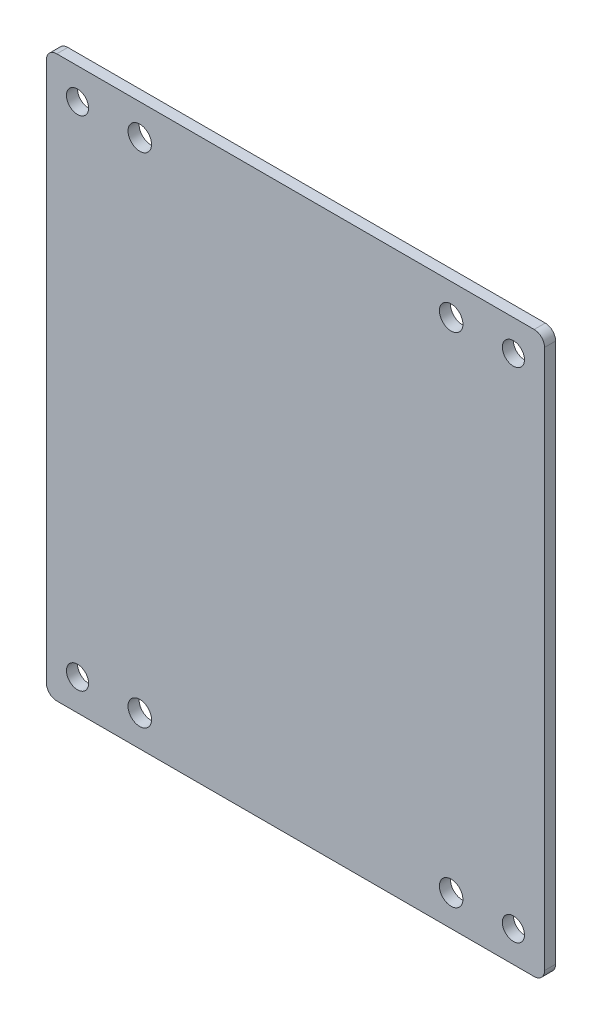
ISO-10303-21;
HEADER;
FILE_DESCRIPTION(('STEP AP214'),'2;1');
FILE_NAME('part.step','',(''),(''),'','','');
FILE_SCHEMA(('AUTOMOTIVE_DESIGN { 1 0 10303 214 1 1 1 1 }'));
ENDSEC;
DATA;
#1=APPLICATION_CONTEXT('core data for automotive mechanical design processes');
#2=APPLICATION_PROTOCOL_DEFINITION('international standard','automotive_design',2000,#1);
#3=PRODUCT_CONTEXT('',#1,'mechanical');
#4=PRODUCT('Part','Part','',(#3));
#5=PRODUCT_RELATED_PRODUCT_CATEGORY('part','',(#4));
#6=PRODUCT_DEFINITION_FORMATION('','',#4);
#7=PRODUCT_DEFINITION_CONTEXT('part definition',#1,'design');
#8=PRODUCT_DEFINITION('design','',#6,#7);
#9=PRODUCT_DEFINITION_SHAPE('','',#8);
#10=(LENGTH_UNIT() NAMED_UNIT(*) SI_UNIT(.MILLI.,.METRE.));
#11=(NAMED_UNIT(*) PLANE_ANGLE_UNIT() SI_UNIT($,.RADIAN.));
#12=(NAMED_UNIT(*) SI_UNIT($,.STERADIAN.) SOLID_ANGLE_UNIT());
#13=UNCERTAINTY_MEASURE_WITH_UNIT(LENGTH_MEASURE(1.E-05),#10,'distance_accuracy_value','');
#14=(GEOMETRIC_REPRESENTATION_CONTEXT(3) GLOBAL_UNCERTAINTY_ASSIGNED_CONTEXT((#13)) GLOBAL_UNIT_ASSIGNED_CONTEXT((#10,
#11,#12)) REPRESENTATION_CONTEXT('',''));
#15=CARTESIAN_POINT('',(0.,0.,0.));
#16=DIRECTION('',(0.,0.,1.));
#17=DIRECTION('',(1.,0.,0.));
#18=AXIS2_PLACEMENT_3D('',#15,#16,#17);
#19=CARTESIAN_POINT('',(79.0698038032,0.,1.6));
#20=DIRECTION('',(-1.,0.,0.));
#21=DIRECTION('',(0.,0.,1.));
#22=AXIS2_PLACEMENT_3D('',#19,#20,#21);
#23=PLANE('',#22);
#24=DIRECTION('',(0.,1.,0.));
#25=VECTOR('',#24,1.);
#26=CARTESIAN_POINT('',(79.0698038032,0.,0.));
#27=LINE('',#26,#25);
#28=CARTESIAN_POINT('',(79.0698038032,220.6038206321,0.));
#29=VERTEX_POINT('',#28);
#30=CARTESIAN_POINT('',(79.0698038032,298.6084304899,0.));
#31=VERTEX_POINT('',#30);
#32=EDGE_CURVE('E155',#29,#31,#27,.T.);
#33=ORIENTED_EDGE('',*,*,#32,.T.);
#34=DIRECTION('',(0.,0.,-1.));
#35=VECTOR('',#34,1.);
#36=CARTESIAN_POINT('',(79.0698038032,298.6084304899,1.6));
#37=LINE('',#36,#35);
#38=CARTESIAN_POINT('',(79.0698038032,298.6084304899,1.6));
#39=VERTEX_POINT('',#38);
#40=EDGE_CURVE('E11',#39,#31,#37,.T.);
#41=ORIENTED_EDGE('',*,*,#40,.F.);
#42=DIRECTION('',(0.,1.,0.));
#43=VECTOR('',#42,1.);
#44=CARTESIAN_POINT('',(79.0698038032,0.,1.6));
#45=LINE('',#44,#43);
#46=CARTESIAN_POINT('',(79.0698038032,220.6038206321,1.6));
#47=VERTEX_POINT('',#46);
#48=EDGE_CURVE('E201',#47,#39,#45,.T.);
#49=ORIENTED_EDGE('',*,*,#48,.F.);
#50=DIRECTION('',(0.,0.,-1.));
#51=VECTOR('',#50,1.);
#52=CARTESIAN_POINT('',(79.0698038032,220.6038206321,1.6));
#53=LINE('',#52,#51);
#54=EDGE_CURVE('E127',#47,#29,#53,.T.);
#55=ORIENTED_EDGE('',*,*,#54,.T.);
#56=EDGE_LOOP('',(#33,#41,#49,#55));
#57=FACE_BOUND('',#56,.T.);
#58=ADVANCED_FACE('F34',(#57),#23,.F.);
#59=CARTESIAN_POINT('',(77.5698038032,298.6084304899,1.6));
#60=DIRECTION('',(0.,0.,-1.));
#61=DIRECTION('',(-1.,0.,0.));
#62=AXIS2_PLACEMENT_3D('',#59,#60,#61);
#63=CYLINDRICAL_SURFACE('',#62,1.5);
#64=CARTESIAN_POINT('',(77.5698038032,298.6084304899,0.));
#65=DIRECTION('',(0.,0.,1.));
#66=DIRECTION('',(1.,0.,0.));
#67=AXIS2_PLACEMENT_3D('',#64,#65,#66);
#68=CIRCLE('',#67,1.5);
#69=CARTESIAN_POINT('',(77.5698038032,300.1084304899,0.));
#70=VERTEX_POINT('',#69);
#71=EDGE_CURVE('E158',#31,#70,#68,.T.);
#72=ORIENTED_EDGE('',*,*,#71,.T.);
#73=DIRECTION('',(0.,0.,-1.));
#74=VECTOR('',#73,1.);
#75=CARTESIAN_POINT('',(77.5698038032,300.1084304899,1.6));
#76=LINE('',#75,#74);
#77=CARTESIAN_POINT('',(77.5698038032,300.1084304899,1.6));
#78=VERTEX_POINT('',#77);
#79=EDGE_CURVE('E43',#78,#70,#76,.T.);
#80=ORIENTED_EDGE('',*,*,#79,.F.);
#81=CARTESIAN_POINT('',(77.5698038032,298.6084304899,1.6));
#82=DIRECTION('',(0.,0.,1.));
#83=DIRECTION('',(1.,0.,0.));
#84=AXIS2_PLACEMENT_3D('',#81,#82,#83);
#85=CIRCLE('',#84,1.5);
#86=EDGE_CURVE('E94',#39,#78,#85,.T.);
#87=ORIENTED_EDGE('',*,*,#86,.F.);
#88=ORIENTED_EDGE('',*,*,#40,.T.);
#89=EDGE_LOOP('',(#72,#80,#87,#88));
#90=FACE_BOUND('',#89,.T.);
#91=ADVANCED_FACE('F263',(#90),#63,.T.);
#92=CARTESIAN_POINT('',(0.,300.1084304899,1.6));
#93=DIRECTION('',(0.,-1.,0.));
#94=DIRECTION('',(0.,0.,-1.));
#95=AXIS2_PLACEMENT_3D('',#92,#93,#94);
#96=PLANE('',#95);
#97=DIRECTION('',(-1.,0.,0.));
#98=VECTOR('',#97,1.);
#99=CARTESIAN_POINT('',(0.,300.1084304899,0.));
#100=LINE('',#99,#98);
#101=CARTESIAN_POINT('',(8.567399569,300.1084304899,0.));
#102=VERTEX_POINT('',#101);
#103=EDGE_CURVE('E160',#70,#102,#100,.T.);
#104=ORIENTED_EDGE('',*,*,#103,.T.);
#105=DIRECTION('',(0.,0.,-1.));
#106=VECTOR('',#105,1.);
#107=CARTESIAN_POINT('',(8.567399569,300.1084304899,1.6));
#108=LINE('',#107,#106);
#109=CARTESIAN_POINT('',(8.567399569,300.1084304899,1.6));
#110=VERTEX_POINT('',#109);
#111=EDGE_CURVE('E176',#110,#102,#108,.T.);
#112=ORIENTED_EDGE('',*,*,#111,.F.);
#113=DIRECTION('',(-1.,0.,0.));
#114=VECTOR('',#113,1.);
#115=CARTESIAN_POINT('',(0.,300.1084304899,1.6));
#116=LINE('',#115,#114);
#117=EDGE_CURVE('E184',#78,#110,#116,.T.);
#118=ORIENTED_EDGE('',*,*,#117,.F.);
#119=ORIENTED_EDGE('',*,*,#79,.T.);
#120=EDGE_LOOP('',(#104,#112,#118,#119));
#121=FACE_BOUND('',#120,.T.);
#122=ADVANCED_FACE('F182',(#121),#96,.F.);
#123=CARTESIAN_POINT('',(8.567399569,298.6084304899,1.6));
#124=DIRECTION('',(0.,0.,-1.));
#125=DIRECTION('',(-1.,0.,0.));
#126=AXIS2_PLACEMENT_3D('',#123,#124,#125);
#127=CYLINDRICAL_SURFACE('',#126,1.50000000000003);
#128=CARTESIAN_POINT('',(8.567399569,298.6084304899,0.));
#129=DIRECTION('',(0.,0.,1.));
#130=DIRECTION('',(1.,0.,0.));
#131=AXIS2_PLACEMENT_3D('',#128,#129,#130);
#132=CIRCLE('',#131,1.50000000000003);
#133=CARTESIAN_POINT('',(7.067399569,298.6084304899,0.));
#134=VERTEX_POINT('',#133);
#135=EDGE_CURVE('E162',#102,#134,#132,.T.);
#136=ORIENTED_EDGE('',*,*,#135,.T.);
#137=DIRECTION('',(0.,0.,-1.));
#138=VECTOR('',#137,1.);
#139=CARTESIAN_POINT('',(7.067399569,298.6084304899,1.6));
#140=LINE('',#139,#138);
#141=CARTESIAN_POINT('',(7.067399569,298.6084304899,1.6));
#142=VERTEX_POINT('',#141);
#143=EDGE_CURVE('E173',#142,#134,#140,.T.);
#144=ORIENTED_EDGE('',*,*,#143,.F.);
#145=CARTESIAN_POINT('',(8.567399569,298.6084304899,1.6));
#146=DIRECTION('',(0.,0.,1.));
#147=DIRECTION('',(1.,0.,0.));
#148=AXIS2_PLACEMENT_3D('',#145,#146,#147);
#149=CIRCLE('',#148,1.50000000000003);
#150=EDGE_CURVE('E196',#110,#142,#149,.T.);
#151=ORIENTED_EDGE('',*,*,#150,.F.);
#152=ORIENTED_EDGE('',*,*,#111,.T.);
#153=EDGE_LOOP('',(#136,#144,#151,#152));
#154=FACE_BOUND('',#153,.T.);
#155=ADVANCED_FACE('F192',(#154),#127,.T.);
#156=CARTESIAN_POINT('',(7.067399569,0.,1.6));
#157=DIRECTION('',(1.,0.,0.));
#158=DIRECTION('',(0.,0.,-1.));
#159=AXIS2_PLACEMENT_3D('',#156,#157,#158);
#160=PLANE('',#159);
#161=DIRECTION('',(0.,-1.,0.));
#162=VECTOR('',#161,1.);
#163=CARTESIAN_POINT('',(7.067399569,0.,0.));
#164=LINE('',#163,#162);
#165=CARTESIAN_POINT('',(7.067399569,220.6038206321,0.));
#166=VERTEX_POINT('',#165);
#167=EDGE_CURVE('E164',#134,#166,#164,.T.);
#168=ORIENTED_EDGE('',*,*,#167,.T.);
#169=DIRECTION('',(0.,0.,-1.));
#170=VECTOR('',#169,1.);
#171=CARTESIAN_POINT('',(7.067399569,220.6038206321,1.6));
#172=LINE('',#171,#170);
#173=CARTESIAN_POINT('',(7.067399569,220.6038206321,1.6));
#174=VERTEX_POINT('',#173);
#175=EDGE_CURVE('E122',#174,#166,#172,.T.);
#176=ORIENTED_EDGE('',*,*,#175,.F.);
#177=DIRECTION('',(0.,-1.,0.));
#178=VECTOR('',#177,1.);
#179=CARTESIAN_POINT('',(7.067399569,0.,1.6));
#180=LINE('',#179,#178);
#181=EDGE_CURVE('E113',#142,#174,#180,.T.);
#182=ORIENTED_EDGE('',*,*,#181,.F.);
#183=ORIENTED_EDGE('',*,*,#143,.T.);
#184=EDGE_LOOP('',(#168,#176,#182,#183));
#185=FACE_BOUND('',#184,.T.);
#186=ADVANCED_FACE('F195',(#185),#160,.F.);
#187=CARTESIAN_POINT('',(8.567399569,220.6038206321,1.6));
#188=DIRECTION('',(0.,0.,-1.));
#189=DIRECTION('',(-1.,0.,0.));
#190=AXIS2_PLACEMENT_3D('',#187,#188,#189);
#191=CYLINDRICAL_SURFACE('',#190,1.5);
#192=CARTESIAN_POINT('',(8.567399569,220.6038206321,0.));
#193=DIRECTION('',(0.,0.,1.));
#194=DIRECTION('',(1.,0.,0.));
#195=AXIS2_PLACEMENT_3D('',#192,#193,#194);
#196=CIRCLE('',#195,1.5);
#197=CARTESIAN_POINT('',(8.567399569,219.1038206321,0.));
#198=VERTEX_POINT('',#197);
#199=EDGE_CURVE('E121',#166,#198,#196,.T.);
#200=ORIENTED_EDGE('',*,*,#199,.T.);
#201=DIRECTION('',(0.,0.,-1.));
#202=VECTOR('',#201,1.);
#203=CARTESIAN_POINT('',(8.567399569,219.1038206321,1.6));
#204=LINE('',#203,#202);
#205=CARTESIAN_POINT('',(8.567399569,219.1038206321,1.6));
#206=VERTEX_POINT('',#205);
#207=EDGE_CURVE('E118',#206,#198,#204,.T.);
#208=ORIENTED_EDGE('',*,*,#207,.F.);
#209=CARTESIAN_POINT('',(8.567399569,220.6038206321,1.6));
#210=DIRECTION('',(0.,0.,1.));
#211=DIRECTION('',(1.,0.,0.));
#212=AXIS2_PLACEMENT_3D('',#209,#210,#211);
#213=CIRCLE('',#212,1.5);
#214=EDGE_CURVE('E107',#174,#206,#213,.T.);
#215=ORIENTED_EDGE('',*,*,#214,.F.);
#216=ORIENTED_EDGE('',*,*,#175,.T.);
#217=EDGE_LOOP('',(#200,#208,#215,#216));
#218=FACE_BOUND('',#217,.T.);
#219=ADVANCED_FACE('F119',(#218),#191,.T.);
#220=CARTESIAN_POINT('',(0.,219.1038206321,1.6));
#221=DIRECTION('',(0.,1.,0.));
#222=DIRECTION('',(0.,0.,1.));
#223=AXIS2_PLACEMENT_3D('',#220,#221,#222);
#224=PLANE('',#223);
#225=DIRECTION('',(1.,0.,0.));
#226=VECTOR('',#225,1.);
#227=CARTESIAN_POINT('',(0.,219.1038206321,0.));
#228=LINE('',#227,#226);
#229=CARTESIAN_POINT('',(77.5698038032,219.1038206321,0.));
#230=VERTEX_POINT('',#229);
#231=EDGE_CURVE('E80',#198,#230,#228,.T.);
#232=ORIENTED_EDGE('',*,*,#231,.T.);
#233=DIRECTION('',(0.,0.,-1.));
#234=VECTOR('',#233,1.);
#235=CARTESIAN_POINT('',(77.5698038032,219.1038206321,1.6));
#236=LINE('',#235,#234);
#237=CARTESIAN_POINT('',(77.5698038032,219.1038206321,1.6));
#238=VERTEX_POINT('',#237);
#239=EDGE_CURVE('E123',#238,#230,#236,.T.);
#240=ORIENTED_EDGE('',*,*,#239,.F.);
#241=DIRECTION('',(1.,0.,0.));
#242=VECTOR('',#241,1.);
#243=CARTESIAN_POINT('',(0.,219.1038206321,1.6));
#244=LINE('',#243,#242);
#245=EDGE_CURVE('E111',#206,#238,#244,.T.);
#246=ORIENTED_EDGE('',*,*,#245,.F.);
#247=ORIENTED_EDGE('',*,*,#207,.T.);
#248=EDGE_LOOP('',(#232,#240,#246,#247));
#249=FACE_BOUND('',#248,.T.);
#250=ADVANCED_FACE('F125',(#249),#224,.F.);
#251=CARTESIAN_POINT('',(20.5667305647,223.60348613,1.6));
#252=DIRECTION('',(0.,0.,-1.));
#253=DIRECTION('',(-1.,0.,0.));
#254=AXIS2_PLACEMENT_3D('',#251,#252,#253);
#255=CYLINDRICAL_SURFACE('',#254,1.7);
#256=CARTESIAN_POINT('',(20.5667305647,223.60348613,1.6));
#257=DIRECTION('',(0.,0.,1.));
#258=DIRECTION('',(1.,0.,0.));
#259=AXIS2_PLACEMENT_3D('',#256,#257,#258);
#260=CIRCLE('',#259,1.7);
#261=CARTESIAN_POINT('',(22.2667305647,223.60348613,1.6));
#262=VERTEX_POINT('',#261);
#263=EDGE_CURVE('E203',#262,#262,#260,.T.);
#264=ORIENTED_EDGE('',*,*,#263,.T.);
#265=EDGE_LOOP('',(#264));
#266=FACE_BOUND('',#265,.T.);
#267=CARTESIAN_POINT('',(20.5667305647,223.60348613,0.));
#268=DIRECTION('',(0.,0.,1.));
#269=DIRECTION('',(1.,0.,0.));
#270=AXIS2_PLACEMENT_3D('',#267,#268,#269);
#271=CIRCLE('',#270,1.7);
#272=CARTESIAN_POINT('',(22.2667305647,223.60348613,0.));
#273=VERTEX_POINT('',#272);
#274=EDGE_CURVE('E152',#273,#273,#271,.T.);
#275=ORIENTED_EDGE('',*,*,#274,.F.);
#276=EDGE_LOOP('',(#275));
#277=FACE_BOUND('',#276,.T.);
#278=ADVANCED_FACE('F247',(#266,#277),#255,.F.);
#279=CARTESIAN_POINT('',(65.5701383054,223.60348613,1.6));
#280=DIRECTION('',(0.,0.,-1.));
#281=DIRECTION('',(-1.,0.,0.));
#282=AXIS2_PLACEMENT_3D('',#279,#280,#281);
#283=CYLINDRICAL_SURFACE('',#282,1.69999999999999);
#284=CARTESIAN_POINT('',(65.5701383054,223.60348613,1.6));
#285=DIRECTION('',(0.,0.,1.));
#286=DIRECTION('',(1.,0.,0.));
#287=AXIS2_PLACEMENT_3D('',#284,#285,#286);
#288=CIRCLE('',#287,1.69999999999999);
#289=CARTESIAN_POINT('',(67.2701383054,223.60348613,1.6));
#290=VERTEX_POINT('',#289);
#291=EDGE_CURVE('E206',#290,#290,#288,.T.);
#292=ORIENTED_EDGE('',*,*,#291,.T.);
#293=EDGE_LOOP('',(#292));
#294=FACE_BOUND('',#293,.T.);
#295=CARTESIAN_POINT('',(65.5701383054,223.60348613,0.));
#296=DIRECTION('',(0.,0.,1.));
#297=DIRECTION('',(1.,0.,0.));
#298=AXIS2_PLACEMENT_3D('',#295,#296,#297);
#299=CIRCLE('',#298,1.69999999999999);
#300=CARTESIAN_POINT('',(67.2701383054,223.60348613,0.));
#301=VERTEX_POINT('',#300);
#302=EDGE_CURVE('E149',#301,#301,#299,.T.);
#303=ORIENTED_EDGE('',*,*,#302,.F.);
#304=EDGE_LOOP('',(#303));
#305=FACE_BOUND('',#304,.T.);
#306=ADVANCED_FACE('F250',(#294,#305),#283,.F.);
#307=CARTESIAN_POINT('',(11.5670650668,223.60348613,1.6));
#308=DIRECTION('',(0.,0.,-1.));
#309=DIRECTION('',(-1.,0.,0.));
#310=AXIS2_PLACEMENT_3D('',#307,#308,#309);
#311=CYLINDRICAL_SURFACE('',#310,1.60027921638226);
#312=CARTESIAN_POINT('',(11.5670650668,223.60348613,1.6));
#313=DIRECTION('',(0.,0.,1.));
#314=DIRECTION('',(1.,0.,0.));
#315=AXIS2_PLACEMENT_3D('',#312,#313,#314);
#316=CIRCLE('',#315,1.60027921638226);
#317=CARTESIAN_POINT('',(13.1673442831823,223.60348613,1.6));
#318=VERTEX_POINT('',#317);
#319=EDGE_CURVE('E209',#318,#318,#316,.T.);
#320=ORIENTED_EDGE('',*,*,#319,.T.);
#321=EDGE_LOOP('',(#320));
#322=FACE_BOUND('',#321,.T.);
#323=CARTESIAN_POINT('',(11.5670650668,223.60348613,0.));
#324=DIRECTION('',(0.,0.,1.));
#325=DIRECTION('',(1.,0.,0.));
#326=AXIS2_PLACEMENT_3D('',#323,#324,#325);
#327=CIRCLE('',#326,1.60027921638226);
#328=CARTESIAN_POINT('',(13.1673442831823,223.60348613,0.));
#329=VERTEX_POINT('',#328);
#330=EDGE_CURVE('E146',#329,#329,#327,.T.);
#331=ORIENTED_EDGE('',*,*,#330,.F.);
#332=EDGE_LOOP('',(#331));
#333=FACE_BOUND('',#332,.T.);
#334=ADVANCED_FACE('F275',(#322,#333),#311,.F.);
#335=CARTESIAN_POINT('',(74.5698038032,223.60348613,1.6));
#336=DIRECTION('',(0.,0.,-1.));
#337=DIRECTION('',(-1.,0.,0.));
#338=AXIS2_PLACEMENT_3D('',#335,#336,#337);
#339=CYLINDRICAL_SURFACE('',#338,1.60027921638224);
#340=CARTESIAN_POINT('',(74.5698038032,223.60348613,1.6));
#341=DIRECTION('',(0.,0.,1.));
#342=DIRECTION('',(1.,0.,0.));
#343=AXIS2_PLACEMENT_3D('',#340,#341,#342);
#344=CIRCLE('',#343,1.60027921638224);
#345=CARTESIAN_POINT('',(76.1700830195823,223.60348613,1.6));
#346=VERTEX_POINT('',#345);
#347=EDGE_CURVE('E212',#346,#346,#344,.T.);
#348=ORIENTED_EDGE('',*,*,#347,.T.);
#349=EDGE_LOOP('',(#348));
#350=FACE_BOUND('',#349,.T.);
#351=CARTESIAN_POINT('',(74.5698038032,223.60348613,0.));
#352=DIRECTION('',(0.,0.,1.));
#353=DIRECTION('',(1.,0.,0.));
#354=AXIS2_PLACEMENT_3D('',#351,#352,#353);
#355=CIRCLE('',#354,1.60027921638224);
#356=CARTESIAN_POINT('',(76.1700830195823,223.60348613,0.));
#357=VERTEX_POINT('',#356);
#358=EDGE_CURVE('E143',#357,#357,#355,.T.);
#359=ORIENTED_EDGE('',*,*,#358,.F.);
#360=EDGE_LOOP('',(#359));
#361=FACE_BOUND('',#360,.T.);
#362=ADVANCED_FACE('F279',(#350,#361),#339,.F.);
#363=CARTESIAN_POINT('',(20.5667305647,295.6084304899,1.6));
#364=DIRECTION('',(0.,0.,-1.));
#365=DIRECTION('',(-1.,0.,0.));
#366=AXIS2_PLACEMENT_3D('',#363,#364,#365);
#367=CYLINDRICAL_SURFACE('',#366,1.7);
#368=CARTESIAN_POINT('',(20.5667305647,295.6084304899,1.6));
#369=DIRECTION('',(0.,0.,1.));
#370=DIRECTION('',(1.,0.,0.));
#371=AXIS2_PLACEMENT_3D('',#368,#369,#370);
#372=CIRCLE('',#371,1.7);
#373=CARTESIAN_POINT('',(22.2667305647,295.6084304899,1.6));
#374=VERTEX_POINT('',#373);
#375=EDGE_CURVE('E215',#374,#374,#372,.T.);
#376=ORIENTED_EDGE('',*,*,#375,.T.);
#377=EDGE_LOOP('',(#376));
#378=FACE_BOUND('',#377,.T.);
#379=CARTESIAN_POINT('',(20.5667305647,295.6084304899,0.));
#380=DIRECTION('',(0.,0.,1.));
#381=DIRECTION('',(1.,0.,0.));
#382=AXIS2_PLACEMENT_3D('',#379,#380,#381);
#383=CIRCLE('',#382,1.7);
#384=CARTESIAN_POINT('',(22.2667305647,295.6084304899,0.));
#385=VERTEX_POINT('',#384);
#386=EDGE_CURVE('E140',#385,#385,#383,.T.);
#387=ORIENTED_EDGE('',*,*,#386,.F.);
#388=EDGE_LOOP('',(#387));
#389=FACE_BOUND('',#388,.T.);
#390=ADVANCED_FACE('F283',(#378,#389),#367,.F.);
#391=CARTESIAN_POINT('',(65.5701383054,295.6084304899,1.6));
#392=DIRECTION('',(0.,0.,-1.));
#393=DIRECTION('',(-1.,0.,0.));
#394=AXIS2_PLACEMENT_3D('',#391,#392,#393);
#395=CYLINDRICAL_SURFACE('',#394,1.69999999999999);
#396=CARTESIAN_POINT('',(65.5701383054,295.6084304899,1.6));
#397=DIRECTION('',(0.,0.,1.));
#398=DIRECTION('',(1.,0.,0.));
#399=AXIS2_PLACEMENT_3D('',#396,#397,#398);
#400=CIRCLE('',#399,1.69999999999999);
#401=CARTESIAN_POINT('',(67.2701383054,295.6084304899,1.6));
#402=VERTEX_POINT('',#401);
#403=EDGE_CURVE('E218',#402,#402,#400,.T.);
#404=ORIENTED_EDGE('',*,*,#403,.T.);
#405=EDGE_LOOP('',(#404));
#406=FACE_BOUND('',#405,.T.);
#407=CARTESIAN_POINT('',(65.5701383054,295.6084304899,0.));
#408=DIRECTION('',(0.,0.,1.));
#409=DIRECTION('',(1.,0.,0.));
#410=AXIS2_PLACEMENT_3D('',#407,#408,#409);
#411=CIRCLE('',#410,1.69999999999999);
#412=CARTESIAN_POINT('',(67.2701383054,295.6084304899,0.));
#413=VERTEX_POINT('',#412);
#414=EDGE_CURVE('E137',#413,#413,#411,.T.);
#415=ORIENTED_EDGE('',*,*,#414,.F.);
#416=EDGE_LOOP('',(#415));
#417=FACE_BOUND('',#416,.T.);
#418=ADVANCED_FACE('F287',(#406,#417),#395,.F.);
#419=CARTESIAN_POINT('',(74.5698038032,295.6084304899,1.6));
#420=DIRECTION('',(0.,0.,-1.));
#421=DIRECTION('',(-1.,0.,0.));
#422=AXIS2_PLACEMENT_3D('',#419,#420,#421);
#423=CYLINDRICAL_SURFACE('',#422,1.60027921638224);
#424=CARTESIAN_POINT('',(74.5698038032,295.6084304899,1.6));
#425=DIRECTION('',(0.,0.,1.));
#426=DIRECTION('',(1.,0.,0.));
#427=AXIS2_PLACEMENT_3D('',#424,#425,#426);
#428=CIRCLE('',#427,1.60027921638224);
#429=CARTESIAN_POINT('',(76.1700830195823,295.6084304899,1.6));
#430=VERTEX_POINT('',#429);
#431=EDGE_CURVE('E221',#430,#430,#428,.T.);
#432=ORIENTED_EDGE('',*,*,#431,.T.);
#433=EDGE_LOOP('',(#432));
#434=FACE_BOUND('',#433,.T.);
#435=CARTESIAN_POINT('',(74.5698038032,295.6084304899,0.));
#436=DIRECTION('',(0.,0.,1.));
#437=DIRECTION('',(1.,0.,0.));
#438=AXIS2_PLACEMENT_3D('',#435,#436,#437);
#439=CIRCLE('',#438,1.60027921638224);
#440=CARTESIAN_POINT('',(76.1700830195823,295.6084304899,0.));
#441=VERTEX_POINT('',#440);
#442=EDGE_CURVE('E134',#441,#441,#439,.T.);
#443=ORIENTED_EDGE('',*,*,#442,.F.);
#444=EDGE_LOOP('',(#443));
#445=FACE_BOUND('',#444,.T.);
#446=ADVANCED_FACE('F290',(#434,#445),#423,.F.);
#447=CARTESIAN_POINT('',(11.5670650668,295.6084304899,1.6));
#448=DIRECTION('',(0.,0.,-1.));
#449=DIRECTION('',(-1.,0.,0.));
#450=AXIS2_PLACEMENT_3D('',#447,#448,#449);
#451=CYLINDRICAL_SURFACE('',#450,1.60027921638224);
#452=CARTESIAN_POINT('',(11.5670650668,295.6084304899,1.6));
#453=DIRECTION('',(0.,0.,1.));
#454=DIRECTION('',(1.,0.,0.));
#455=AXIS2_PLACEMENT_3D('',#452,#453,#454);
#456=CIRCLE('',#455,1.60027921638224);
#457=CARTESIAN_POINT('',(13.1673442831822,295.6084304899,1.6));
#458=VERTEX_POINT('',#457);
#459=EDGE_CURVE('E169',#458,#458,#456,.T.);
#460=ORIENTED_EDGE('',*,*,#459,.T.);
#461=EDGE_LOOP('',(#460));
#462=FACE_BOUND('',#461,.T.);
#463=CARTESIAN_POINT('',(11.5670650668,295.6084304899,0.));
#464=DIRECTION('',(0.,0.,1.));
#465=DIRECTION('',(1.,0.,0.));
#466=AXIS2_PLACEMENT_3D('',#463,#464,#465);
#467=CIRCLE('',#466,1.60027921638224);
#468=CARTESIAN_POINT('',(13.1673442831822,295.6084304899,0.));
#469=VERTEX_POINT('',#468);
#470=EDGE_CURVE('E131',#469,#469,#467,.T.);
#471=ORIENTED_EDGE('',*,*,#470,.F.);
#472=EDGE_LOOP('',(#471));
#473=FACE_BOUND('',#472,.T.);
#474=ADVANCED_FACE('F36',(#462,#473),#451,.F.);
#475=CARTESIAN_POINT('',(77.5698038032,220.6038206321,1.6));
#476=DIRECTION('',(0.,0.,-1.));
#477=DIRECTION('',(-1.,0.,0.));
#478=AXIS2_PLACEMENT_3D('',#475,#476,#477);
#479=CYLINDRICAL_SURFACE('',#478,1.5);
#480=CARTESIAN_POINT('',(77.5698038032,220.6038206321,0.));
#481=DIRECTION('',(0.,0.,1.));
#482=DIRECTION('',(1.,0.,0.));
#483=AXIS2_PLACEMENT_3D('',#480,#481,#482);
#484=CIRCLE('',#483,1.5);
#485=EDGE_CURVE('E86',#230,#29,#484,.T.);
#486=ORIENTED_EDGE('',*,*,#485,.T.);
#487=ORIENTED_EDGE('',*,*,#54,.F.);
#488=CARTESIAN_POINT('',(77.5698038032,220.6038206321,1.6));
#489=DIRECTION('',(0.,0.,1.));
#490=DIRECTION('',(1.,0.,0.));
#491=AXIS2_PLACEMENT_3D('',#488,#489,#490);
#492=CIRCLE('',#491,1.5);
#493=EDGE_CURVE('E51',#238,#47,#492,.T.);
#494=ORIENTED_EDGE('',*,*,#493,.F.);
#495=ORIENTED_EDGE('',*,*,#239,.T.);
#496=EDGE_LOOP('',(#486,#487,#494,#495));
#497=FACE_BOUND('',#496,.T.);
#498=ADVANCED_FACE('F231',(#497),#479,.T.);
#499=CARTESIAN_POINT('',(0.,0.,1.6));
#500=DIRECTION('',(0.,0.,1.));
#501=DIRECTION('',(1.,0.,0.));
#502=AXIS2_PLACEMENT_3D('',#499,#500,#501);
#503=PLANE('',#502);
#504=ORIENTED_EDGE('',*,*,#459,.F.);
#505=EDGE_LOOP('',(#504));
#506=FACE_BOUND('',#505,.T.);
#507=ORIENTED_EDGE('',*,*,#431,.F.);
#508=EDGE_LOOP('',(#507));
#509=FACE_BOUND('',#508,.T.);
#510=ORIENTED_EDGE('',*,*,#403,.F.);
#511=EDGE_LOOP('',(#510));
#512=FACE_BOUND('',#511,.T.);
#513=ORIENTED_EDGE('',*,*,#375,.F.);
#514=EDGE_LOOP('',(#513));
#515=FACE_BOUND('',#514,.T.);
#516=ORIENTED_EDGE('',*,*,#347,.F.);
#517=EDGE_LOOP('',(#516));
#518=FACE_BOUND('',#517,.T.);
#519=ORIENTED_EDGE('',*,*,#319,.F.);
#520=EDGE_LOOP('',(#519));
#521=FACE_BOUND('',#520,.T.);
#522=ORIENTED_EDGE('',*,*,#291,.F.);
#523=EDGE_LOOP('',(#522));
#524=FACE_BOUND('',#523,.T.);
#525=ORIENTED_EDGE('',*,*,#263,.F.);
#526=EDGE_LOOP('',(#525));
#527=FACE_BOUND('',#526,.T.);
#528=ORIENTED_EDGE('',*,*,#48,.T.);
#529=ORIENTED_EDGE('',*,*,#86,.T.);
#530=ORIENTED_EDGE('',*,*,#117,.T.);
#531=ORIENTED_EDGE('',*,*,#150,.T.);
#532=ORIENTED_EDGE('',*,*,#181,.T.);
#533=ORIENTED_EDGE('',*,*,#214,.T.);
#534=ORIENTED_EDGE('',*,*,#245,.T.);
#535=ORIENTED_EDGE('',*,*,#493,.T.);
#536=EDGE_LOOP('',(#528,#529,#530,#531,#532,#533,#534,#535));
#537=FACE_BOUND('',#536,.T.);
#538=ADVANCED_FACE('F109',(#506,#509,#512,#515,#518,#521,#524,#527,#537),#503,.T.);
#539=CARTESIAN_POINT('',(0.,0.,0.));
#540=DIRECTION('',(0.,0.,1.));
#541=DIRECTION('',(1.,0.,0.));
#542=AXIS2_PLACEMENT_3D('',#539,#540,#541);
#543=PLANE('',#542);
#544=ORIENTED_EDGE('',*,*,#470,.T.);
#545=EDGE_LOOP('',(#544));
#546=FACE_BOUND('',#545,.T.);
#547=ORIENTED_EDGE('',*,*,#442,.T.);
#548=EDGE_LOOP('',(#547));
#549=FACE_BOUND('',#548,.T.);
#550=ORIENTED_EDGE('',*,*,#414,.T.);
#551=EDGE_LOOP('',(#550));
#552=FACE_BOUND('',#551,.T.);
#553=ORIENTED_EDGE('',*,*,#386,.T.);
#554=EDGE_LOOP('',(#553));
#555=FACE_BOUND('',#554,.T.);
#556=ORIENTED_EDGE('',*,*,#358,.T.);
#557=EDGE_LOOP('',(#556));
#558=FACE_BOUND('',#557,.T.);
#559=ORIENTED_EDGE('',*,*,#330,.T.);
#560=EDGE_LOOP('',(#559));
#561=FACE_BOUND('',#560,.T.);
#562=ORIENTED_EDGE('',*,*,#302,.T.);
#563=EDGE_LOOP('',(#562));
#564=FACE_BOUND('',#563,.T.);
#565=ORIENTED_EDGE('',*,*,#274,.T.);
#566=EDGE_LOOP('',(#565));
#567=FACE_BOUND('',#566,.T.);
#568=ORIENTED_EDGE('',*,*,#32,.F.);
#569=ORIENTED_EDGE('',*,*,#485,.F.);
#570=ORIENTED_EDGE('',*,*,#231,.F.);
#571=ORIENTED_EDGE('',*,*,#199,.F.);
#572=ORIENTED_EDGE('',*,*,#167,.F.);
#573=ORIENTED_EDGE('',*,*,#135,.F.);
#574=ORIENTED_EDGE('',*,*,#103,.F.);
#575=ORIENTED_EDGE('',*,*,#71,.F.);
#576=EDGE_LOOP('',(#568,#569,#570,#571,#572,#573,#574,#575));
#577=FACE_BOUND('',#576,.T.);
#578=ADVANCED_FACE('F188',(#546,#549,#552,#555,#558,#561,#564,#567,#577),#543,.F.);
#579=CLOSED_SHELL('',(#58,#91,#122,#155,#186,#219,#250,#278,#306,#334,#362,#390,#418,#446,#474,
#498,#538,#578));
#580=MANIFOLD_SOLID_BREP('B2',#579);
#581=ADVANCED_BREP_SHAPE_REPRESENTATION('',(#18,#580),#14);
#582=SHAPE_DEFINITION_REPRESENTATION(#9,#581);
ENDSEC;
END-ISO-10303-21;
